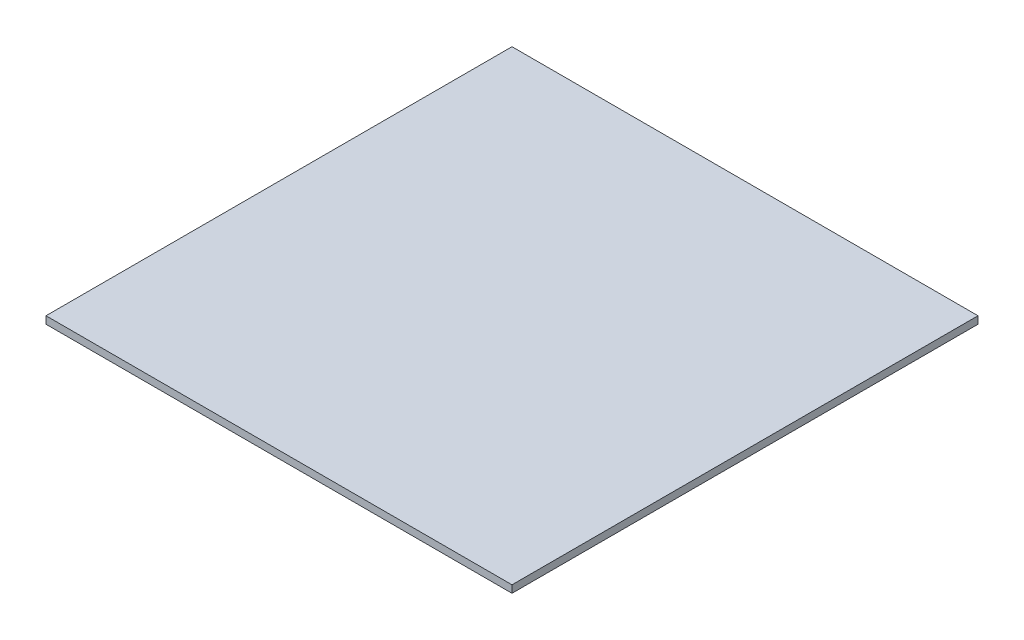
ISO-10303-21;
HEADER;
FILE_DESCRIPTION(('STEP AP214'),'2;1');
FILE_NAME('part.step','',(''),(''),'','','');
FILE_SCHEMA(('AUTOMOTIVE_DESIGN { 1 0 10303 214 1 1 1 1 }'));
ENDSEC;
DATA;
#1=APPLICATION_CONTEXT('core data for automotive mechanical design processes');
#2=APPLICATION_PROTOCOL_DEFINITION('international standard','automotive_design',2000,#1);
#3=PRODUCT_CONTEXT('',#1,'mechanical');
#4=PRODUCT('Part','Part','',(#3));
#5=PRODUCT_RELATED_PRODUCT_CATEGORY('part','',(#4));
#6=PRODUCT_DEFINITION_FORMATION('','',#4);
#7=PRODUCT_DEFINITION_CONTEXT('part definition',#1,'design');
#8=PRODUCT_DEFINITION('design','',#6,#7);
#9=PRODUCT_DEFINITION_SHAPE('','',#8);
#10=(LENGTH_UNIT() NAMED_UNIT(*) SI_UNIT(.MILLI.,.METRE.));
#11=(NAMED_UNIT(*) PLANE_ANGLE_UNIT() SI_UNIT($,.RADIAN.));
#12=(NAMED_UNIT(*) SI_UNIT($,.STERADIAN.) SOLID_ANGLE_UNIT());
#13=UNCERTAINTY_MEASURE_WITH_UNIT(LENGTH_MEASURE(1.E-05),#10,'distance_accuracy_value','');
#14=(GEOMETRIC_REPRESENTATION_CONTEXT(3) GLOBAL_UNCERTAINTY_ASSIGNED_CONTEXT((#13)) GLOBAL_UNIT_ASSIGNED_CONTEXT((#10,
#11,#12)) REPRESENTATION_CONTEXT('',''));
#15=CARTESIAN_POINT('',(0.,0.,0.));
#16=DIRECTION('',(0.,0.,1.));
#17=DIRECTION('',(1.,0.,0.));
#18=AXIS2_PLACEMENT_3D('',#15,#16,#17);
#19=CARTESIAN_POINT('',(0.,5.7,0.));
#20=DIRECTION('',(1.,0.,0.));
#21=DIRECTION('',(0.,0.,-1.));
#22=AXIS2_PLACEMENT_3D('',#19,#20,#21);
#23=PLANE('',#22);
#24=DIRECTION('',(0.,0.,1.));
#25=VECTOR('',#24,1.);
#26=CARTESIAN_POINT('',(0.,0.,0.));
#27=LINE('',#26,#25);
#28=CARTESIAN_POINT('',(0.,0.,-360.));
#29=VERTEX_POINT('',#28);
#30=CARTESIAN_POINT('',(0.,0.,0.));
#31=VERTEX_POINT('',#30);
#32=EDGE_CURVE('E100',#29,#31,#27,.T.);
#33=ORIENTED_EDGE('',*,*,#32,.T.);
#34=DIRECTION('',(0.,-1.,0.));
#35=VECTOR('',#34,1.);
#36=CARTESIAN_POINT('',(0.,5.7,0.));
#37=LINE('',#36,#35);
#38=CARTESIAN_POINT('',(0.,5.7,0.));
#39=VERTEX_POINT('',#38);
#40=EDGE_CURVE('E11',#39,#31,#37,.T.);
#41=ORIENTED_EDGE('',*,*,#40,.F.);
#42=DIRECTION('',(0.,0.,1.));
#43=VECTOR('',#42,1.);
#44=CARTESIAN_POINT('',(0.,5.7,0.));
#45=LINE('',#44,#43);
#46=CARTESIAN_POINT('',(0.,5.7,-360.));
#47=VERTEX_POINT('',#46);
#48=EDGE_CURVE('E88',#47,#39,#45,.T.);
#49=ORIENTED_EDGE('',*,*,#48,.F.);
#50=DIRECTION('',(0.,-1.,0.));
#51=VECTOR('',#50,1.);
#52=CARTESIAN_POINT('',(0.,5.7,-360.));
#53=LINE('',#52,#51);
#54=EDGE_CURVE('E96',#47,#29,#53,.T.);
#55=ORIENTED_EDGE('',*,*,#54,.T.);
#56=EDGE_LOOP('',(#33,#41,#49,#55));
#57=FACE_BOUND('',#56,.T.);
#58=ADVANCED_FACE('F37',(#57),#23,.F.);
#59=CARTESIAN_POINT('',(0.,5.7,0.));
#60=DIRECTION('',(0.,0.,-1.));
#61=DIRECTION('',(-1.,0.,0.));
#62=AXIS2_PLACEMENT_3D('',#59,#60,#61);
#63=PLANE('',#62);
#64=DIRECTION('',(1.,0.,0.));
#65=VECTOR('',#64,1.);
#66=CARTESIAN_POINT('',(0.,0.,0.));
#67=LINE('',#66,#65);
#68=CARTESIAN_POINT('',(360.,0.,0.));
#69=VERTEX_POINT('',#68);
#70=EDGE_CURVE('E92',#31,#69,#67,.T.);
#71=ORIENTED_EDGE('',*,*,#70,.T.);
#72=DIRECTION('',(0.,-1.,0.));
#73=VECTOR('',#72,1.);
#74=CARTESIAN_POINT('',(360.,5.7,0.));
#75=LINE('',#74,#73);
#76=CARTESIAN_POINT('',(360.,5.7,0.));
#77=VERTEX_POINT('',#76);
#78=EDGE_CURVE('E45',#77,#69,#75,.T.);
#79=ORIENTED_EDGE('',*,*,#78,.F.);
#80=DIRECTION('',(1.,0.,0.));
#81=VECTOR('',#80,1.);
#82=CARTESIAN_POINT('',(0.,5.7,0.));
#83=LINE('',#82,#81);
#84=EDGE_CURVE('E83',#39,#77,#83,.T.);
#85=ORIENTED_EDGE('',*,*,#84,.F.);
#86=ORIENTED_EDGE('',*,*,#40,.T.);
#87=EDGE_LOOP('',(#71,#79,#85,#86));
#88=FACE_BOUND('',#87,.T.);
#89=ADVANCED_FACE('F91',(#88),#63,.F.);
#90=CARTESIAN_POINT('',(360.,5.7,0.));
#91=DIRECTION('',(-1.,0.,0.));
#92=DIRECTION('',(0.,0.,1.));
#93=AXIS2_PLACEMENT_3D('',#90,#91,#92);
#94=PLANE('',#93);
#95=DIRECTION('',(0.,0.,-1.));
#96=VECTOR('',#95,1.);
#97=CARTESIAN_POINT('',(360.,0.,0.));
#98=LINE('',#97,#96);
#99=CARTESIAN_POINT('',(360.,0.,-360.));
#100=VERTEX_POINT('',#99);
#101=EDGE_CURVE('E70',#69,#100,#98,.T.);
#102=ORIENTED_EDGE('',*,*,#101,.T.);
#103=DIRECTION('',(0.,-1.,0.));
#104=VECTOR('',#103,1.);
#105=CARTESIAN_POINT('',(360.,5.7,-360.));
#106=LINE('',#105,#104);
#107=CARTESIAN_POINT('',(360.,5.7,-360.));
#108=VERTEX_POINT('',#107);
#109=EDGE_CURVE('E93',#108,#100,#106,.T.);
#110=ORIENTED_EDGE('',*,*,#109,.F.);
#111=DIRECTION('',(0.,0.,-1.));
#112=VECTOR('',#111,1.);
#113=CARTESIAN_POINT('',(360.,5.7,0.));
#114=LINE('',#113,#112);
#115=EDGE_CURVE('E86',#77,#108,#114,.T.);
#116=ORIENTED_EDGE('',*,*,#115,.F.);
#117=ORIENTED_EDGE('',*,*,#78,.T.);
#118=EDGE_LOOP('',(#102,#110,#116,#117));
#119=FACE_BOUND('',#118,.T.);
#120=ADVANCED_FACE('F94',(#119),#94,.F.);
#121=CARTESIAN_POINT('',(0.,5.7,-360.));
#122=DIRECTION('',(0.,0.,1.));
#123=DIRECTION('',(1.,0.,0.));
#124=AXIS2_PLACEMENT_3D('',#121,#122,#123);
#125=PLANE('',#124);
#126=DIRECTION('',(-1.,0.,0.));
#127=VECTOR('',#126,1.);
#128=CARTESIAN_POINT('',(0.,0.,-360.));
#129=LINE('',#128,#127);
#130=EDGE_CURVE('E76',#100,#29,#129,.T.);
#131=ORIENTED_EDGE('',*,*,#130,.T.);
#132=ORIENTED_EDGE('',*,*,#54,.F.);
#133=DIRECTION('',(-1.,0.,0.));
#134=VECTOR('',#133,1.);
#135=CARTESIAN_POINT('',(0.,5.7,-360.));
#136=LINE('',#135,#134);
#137=EDGE_CURVE('E53',#108,#47,#136,.T.);
#138=ORIENTED_EDGE('',*,*,#137,.F.);
#139=ORIENTED_EDGE('',*,*,#109,.T.);
#140=EDGE_LOOP('',(#131,#132,#138,#139));
#141=FACE_BOUND('',#140,.T.);
#142=ADVANCED_FACE('F107',(#141),#125,.F.);
#143=CARTESIAN_POINT('',(0.,5.7,0.));
#144=DIRECTION('',(0.,-1.,0.));
#145=DIRECTION('',(0.,0.,-1.));
#146=AXIS2_PLACEMENT_3D('',#143,#144,#145);
#147=PLANE('',#146);
#148=ORIENTED_EDGE('',*,*,#48,.T.);
#149=ORIENTED_EDGE('',*,*,#84,.T.);
#150=ORIENTED_EDGE('',*,*,#115,.T.);
#151=ORIENTED_EDGE('',*,*,#137,.T.);
#152=EDGE_LOOP('',(#148,#149,#150,#151));
#153=FACE_BOUND('',#152,.T.);
#154=ADVANCED_FACE('F84',(#153),#147,.F.);
#155=CARTESIAN_POINT('',(0.,0.,0.));
#156=DIRECTION('',(0.,-1.,0.));
#157=DIRECTION('',(0.,0.,-1.));
#158=AXIS2_PLACEMENT_3D('',#155,#156,#157);
#159=PLANE('',#158);
#160=ORIENTED_EDGE('',*,*,#32,.F.);
#161=ORIENTED_EDGE('',*,*,#130,.F.);
#162=ORIENTED_EDGE('',*,*,#101,.F.);
#163=ORIENTED_EDGE('',*,*,#70,.F.);
#164=EDGE_LOOP('',(#160,#161,#162,#163));
#165=FACE_BOUND('',#164,.T.);
#166=ADVANCED_FACE('F110',(#165),#159,.T.);
#167=CLOSED_SHELL('',(#58,#89,#120,#142,#154,#166));
#168=MANIFOLD_SOLID_BREP('B2',#167);
#169=ADVANCED_BREP_SHAPE_REPRESENTATION('',(#18,#168),#14);
#170=SHAPE_DEFINITION_REPRESENTATION(#9,#169);
ENDSEC;
END-ISO-10303-21;
